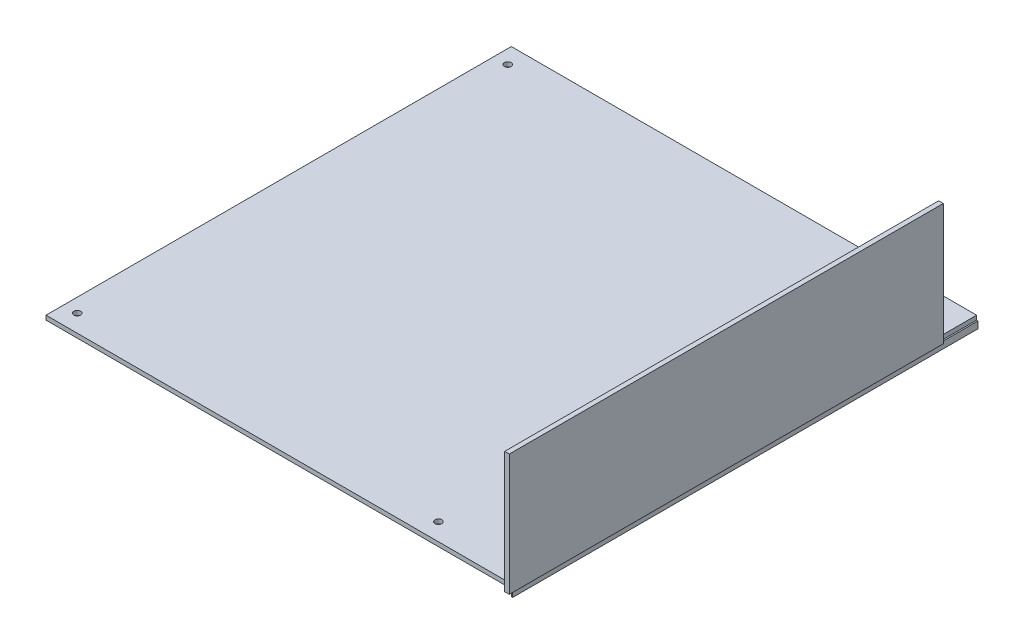
ISO-10303-21;
HEADER;
FILE_DESCRIPTION(('STEP AP214'),'2;1');
FILE_NAME('part.step','',(''),(''),'','','');
FILE_SCHEMA(('AUTOMOTIVE_DESIGN { 1 0 10303 214 1 1 1 1 }'));
ENDSEC;
DATA;
#1=APPLICATION_CONTEXT('core data for automotive mechanical design processes');
#2=APPLICATION_PROTOCOL_DEFINITION('international standard','automotive_design',2000,#1);
#3=PRODUCT_CONTEXT('',#1,'mechanical');
#4=PRODUCT('Part','Part','',(#3));
#5=PRODUCT_RELATED_PRODUCT_CATEGORY('part','',(#4));
#6=PRODUCT_DEFINITION_FORMATION('','',#4);
#7=PRODUCT_DEFINITION_CONTEXT('part definition',#1,'design');
#8=PRODUCT_DEFINITION('design','',#6,#7);
#9=PRODUCT_DEFINITION_SHAPE('','',#8);
#10=(LENGTH_UNIT() NAMED_UNIT(*) SI_UNIT(.MILLI.,.METRE.));
#11=(NAMED_UNIT(*) PLANE_ANGLE_UNIT() SI_UNIT($,.RADIAN.));
#12=(NAMED_UNIT(*) SI_UNIT($,.STERADIAN.) SOLID_ANGLE_UNIT());
#13=UNCERTAINTY_MEASURE_WITH_UNIT(LENGTH_MEASURE(1.E-05),#10,'distance_accuracy_value','');
#14=(GEOMETRIC_REPRESENTATION_CONTEXT(3) GLOBAL_UNCERTAINTY_ASSIGNED_CONTEXT((#13)) GLOBAL_UNIT_ASSIGNED_CONTEXT((#10,
#11,#12)) REPRESENTATION_CONTEXT('',''));
#15=CARTESIAN_POINT('',(0.,0.,0.));
#16=DIRECTION('',(0.,0.,1.));
#17=DIRECTION('',(1.,0.,0.));
#18=AXIS2_PLACEMENT_3D('',#15,#16,#17);
#19=CARTESIAN_POINT('',(0.5,0.,0.));
#20=DIRECTION('',(0.,0.,-1.));
#21=DIRECTION('',(0.,1.,0.));
#22=AXIS2_PLACEMENT_3D('',#19,#20,#21);
#23=PLANE('',#22);
#24=DIRECTION('',(0.,-1.,0.));
#25=VECTOR('',#24,1.);
#26=CARTESIAN_POINT('',(0.,0.,0.));
#27=LINE('',#26,#25);
#28=CARTESIAN_POINT('',(0.,0.,0.));
#29=VERTEX_POINT('',#28);
#30=CARTESIAN_POINT('',(0.,-2.5,0.));
#31=VERTEX_POINT('',#30);
#32=EDGE_CURVE('E110',#29,#31,#27,.T.);
#33=ORIENTED_EDGE('',*,*,#32,.T.);
#34=DIRECTION('',(-1.,0.,0.));
#35=VECTOR('',#34,1.);
#36=CARTESIAN_POINT('',(0.5,-2.5,0.));
#37=LINE('',#36,#35);
#38=CARTESIAN_POINT('',(0.5,-2.5,0.));
#39=VERTEX_POINT('',#38);
#40=EDGE_CURVE('E12',#39,#31,#37,.T.);
#41=ORIENTED_EDGE('',*,*,#40,.F.);
#42=DIRECTION('',(0.,-1.,0.));
#43=VECTOR('',#42,1.);
#44=CARTESIAN_POINT('',(0.5,0.,0.));
#45=LINE('',#44,#43);
#46=CARTESIAN_POINT('',(0.5,0.,0.));
#47=VERTEX_POINT('',#46);
#48=EDGE_CURVE('E98',#47,#39,#45,.T.);
#49=ORIENTED_EDGE('',*,*,#48,.F.);
#50=DIRECTION('',(-1.,0.,0.));
#51=VECTOR('',#50,1.);
#52=CARTESIAN_POINT('',(0.5,0.,0.));
#53=LINE('',#52,#51);
#54=EDGE_CURVE('E106',#47,#29,#53,.T.);
#55=ORIENTED_EDGE('',*,*,#54,.T.);
#56=EDGE_LOOP('',(#33,#41,#49,#55));
#57=FACE_BOUND('',#56,.T.);
#58=ADVANCED_FACE('F47',(#57),#23,.F.);
#59=CARTESIAN_POINT('',(0.5,-2.5,0.));
#60=DIRECTION('',(0.,1.,0.));
#61=DIRECTION('',(0.,0.,1.));
#62=AXIS2_PLACEMENT_3D('',#59,#60,#61);
#63=PLANE('',#62);
#64=DIRECTION('',(0.,0.,-1.));
#65=VECTOR('',#64,1.);
#66=CARTESIAN_POINT('',(0.,-2.5,0.));
#67=LINE('',#66,#65);
#68=CARTESIAN_POINT('',(0.,-2.5,-170.18));
#69=VERTEX_POINT('',#68);
#70=EDGE_CURVE('E102',#31,#69,#67,.T.);
#71=ORIENTED_EDGE('',*,*,#70,.T.);
#72=DIRECTION('',(-1.,0.,0.));
#73=VECTOR('',#72,1.);
#74=CARTESIAN_POINT('',(0.5,-2.5,-170.18));
#75=LINE('',#74,#73);
#76=CARTESIAN_POINT('',(0.5,-2.5,-170.18));
#77=VERTEX_POINT('',#76);
#78=EDGE_CURVE('E55',#77,#69,#75,.T.);
#79=ORIENTED_EDGE('',*,*,#78,.F.);
#80=DIRECTION('',(0.,0.,-1.));
#81=VECTOR('',#80,1.);
#82=CARTESIAN_POINT('',(0.5,-2.5,0.));
#83=LINE('',#82,#81);
#84=EDGE_CURVE('E93',#39,#77,#83,.T.);
#85=ORIENTED_EDGE('',*,*,#84,.F.);
#86=ORIENTED_EDGE('',*,*,#40,.T.);
#87=EDGE_LOOP('',(#71,#79,#85,#86));
#88=FACE_BOUND('',#87,.T.);
#89=ADVANCED_FACE('F101',(#88),#63,.F.);
#90=CARTESIAN_POINT('',(0.5,0.,-170.18));
#91=DIRECTION('',(0.,0.,1.));
#92=DIRECTION('',(1.,0.,0.));
#93=AXIS2_PLACEMENT_3D('',#90,#91,#92);
#94=PLANE('',#93);
#95=DIRECTION('',(0.,1.,0.));
#96=VECTOR('',#95,1.);
#97=CARTESIAN_POINT('',(0.,0.,-170.18));
#98=LINE('',#97,#96);
#99=CARTESIAN_POINT('',(0.,0.,-170.18));
#100=VERTEX_POINT('',#99);
#101=EDGE_CURVE('E80',#69,#100,#98,.T.);
#102=ORIENTED_EDGE('',*,*,#101,.T.);
#103=DIRECTION('',(-1.,0.,0.));
#104=VECTOR('',#103,1.);
#105=CARTESIAN_POINT('',(0.5,0.,-170.18));
#106=LINE('',#105,#104);
#107=CARTESIAN_POINT('',(0.5,0.,-170.18));
#108=VERTEX_POINT('',#107);
#109=EDGE_CURVE('E103',#108,#100,#106,.T.);
#110=ORIENTED_EDGE('',*,*,#109,.F.);
#111=DIRECTION('',(0.,1.,0.));
#112=VECTOR('',#111,1.);
#113=CARTESIAN_POINT('',(0.5,0.,-170.18));
#114=LINE('',#113,#112);
#115=EDGE_CURVE('E96',#77,#108,#114,.T.);
#116=ORIENTED_EDGE('',*,*,#115,.F.);
#117=ORIENTED_EDGE('',*,*,#78,.T.);
#118=EDGE_LOOP('',(#102,#110,#116,#117));
#119=FACE_BOUND('',#118,.T.);
#120=ADVANCED_FACE('F104',(#119),#94,.F.);
#121=CARTESIAN_POINT('',(0.5,0.,0.));
#122=DIRECTION('',(0.,-1.,0.));
#123=DIRECTION('',(0.,0.,-1.));
#124=AXIS2_PLACEMENT_3D('',#121,#122,#123);
#125=PLANE('',#124);
#126=DIRECTION('',(0.,0.,1.));
#127=VECTOR('',#126,1.);
#128=CARTESIAN_POINT('',(0.,0.,0.));
#129=LINE('',#128,#127);
#130=EDGE_CURVE('E86',#100,#29,#129,.T.);
#131=ORIENTED_EDGE('',*,*,#130,.T.);
#132=ORIENTED_EDGE('',*,*,#54,.F.);
#133=DIRECTION('',(0.,0.,1.));
#134=VECTOR('',#133,1.);
#135=CARTESIAN_POINT('',(0.5,0.,0.));
#136=LINE('',#135,#134);
#137=EDGE_CURVE('E63',#108,#47,#136,.T.);
#138=ORIENTED_EDGE('',*,*,#137,.F.);
#139=ORIENTED_EDGE('',*,*,#109,.T.);
#140=EDGE_LOOP('',(#131,#132,#138,#139));
#141=FACE_BOUND('',#140,.T.);
#142=ADVANCED_FACE('F117',(#141),#125,.F.);
#143=CARTESIAN_POINT('',(0.5,0.,0.));
#144=DIRECTION('',(1.,0.,0.));
#145=DIRECTION('',(0.,0.,-1.));
#146=AXIS2_PLACEMENT_3D('',#143,#144,#145);
#147=PLANE('',#146);
#148=ORIENTED_EDGE('',*,*,#48,.T.);
#149=ORIENTED_EDGE('',*,*,#84,.T.);
#150=ORIENTED_EDGE('',*,*,#115,.T.);
#151=ORIENTED_EDGE('',*,*,#137,.T.);
#152=EDGE_LOOP('',(#148,#149,#150,#151));
#153=FACE_BOUND('',#152,.T.);
#154=ADVANCED_FACE('F94',(#153),#147,.T.);
#155=CARTESIAN_POINT('',(0.,0.,0.));
#156=DIRECTION('',(1.,0.,0.));
#157=DIRECTION('',(0.,0.,-1.));
#158=AXIS2_PLACEMENT_3D('',#155,#156,#157);
#159=PLANE('',#158);
#160=ORIENTED_EDGE('',*,*,#32,.F.);
#161=ORIENTED_EDGE('',*,*,#130,.F.);
#162=ORIENTED_EDGE('',*,*,#101,.F.);
#163=ORIENTED_EDGE('',*,*,#70,.F.);
#164=EDGE_LOOP('',(#160,#161,#162,#163));
#165=FACE_BOUND('',#164,.T.);
#166=ADVANCED_FACE('F120',(#165),#159,.F.);
#167=CLOSED_SHELL('',(#58,#89,#120,#142,#154,#166));
#168=MANIFOLD_SOLID_BREP('B2',#167);
#169=CARTESIAN_POINT('',(0.,1.57,0.));
#170=DIRECTION('',(-1.,0.,0.));
#171=DIRECTION('',(0.,0.,1.));
#172=AXIS2_PLACEMENT_3D('',#169,#170,#171);
#173=PLANE('',#172);
#174=DIRECTION('',(0.,1.,0.));
#175=VECTOR('',#174,1.);
#176=CARTESIAN_POINT('',(0.,44.75,-156.31));
#177=LINE('',#176,#175);
#178=CARTESIAN_POINT('',(0.,0.300000000000002,-156.31));
#179=VERTEX_POINT('',#178);
#180=CARTESIAN_POINT('',(0.,1.57,-156.31));
#181=VERTEX_POINT('',#180);
#182=EDGE_CURVE('E345',#179,#181,#177,.T.);
#183=ORIENTED_EDGE('',*,*,#182,.F.);
#184=DIRECTION('',(0.,0.,-1.));
#185=VECTOR('',#184,1.);
#186=CARTESIAN_POINT('',(0.,0.300000000000002,-156.31));
#187=LINE('',#186,#185);
#188=CARTESIAN_POINT('',(0.,0.299999999999991,0.));
#189=VERTEX_POINT('',#188);
#190=EDGE_CURVE('E45',#189,#179,#187,.T.);
#191=ORIENTED_EDGE('',*,*,#190,.F.);
#192=DIRECTION('',(0.,-1.,0.));
#193=VECTOR('',#192,1.);
#194=CARTESIAN_POINT('',(0.,1.57,0.));
#195=LINE('',#194,#193);
#196=CARTESIAN_POINT('',(0.,0.,0.));
#197=VERTEX_POINT('',#196);
#198=EDGE_CURVE('E303',#189,#197,#195,.T.);
#199=ORIENTED_EDGE('',*,*,#198,.T.);
#200=DIRECTION('',(0.,0.,-1.));
#201=VECTOR('',#200,1.);
#202=CARTESIAN_POINT('',(0.,0.,0.));
#203=LINE('',#202,#201);
#204=CARTESIAN_POINT('',(0.,0.,-170.18));
#205=VERTEX_POINT('',#204);
#206=EDGE_CURVE('E294',#197,#205,#203,.T.);
#207=ORIENTED_EDGE('',*,*,#206,.T.);
#208=DIRECTION('',(0.,-1.,0.));
#209=VECTOR('',#208,1.);
#210=CARTESIAN_POINT('',(0.,1.57,-170.18));
#211=LINE('',#210,#209);
#212=CARTESIAN_POINT('',(0.,1.57,-170.18));
#213=VERTEX_POINT('',#212);
#214=EDGE_CURVE('E174',#213,#205,#211,.T.);
#215=ORIENTED_EDGE('',*,*,#214,.F.);
#216=DIRECTION('',(0.,0.,-1.));
#217=VECTOR('',#216,1.);
#218=CARTESIAN_POINT('',(0.,1.57,0.));
#219=LINE('',#218,#217);
#220=EDGE_CURVE('E191',#181,#213,#219,.T.);
#221=ORIENTED_EDGE('',*,*,#220,.F.);
#222=EDGE_LOOP('',(#183,#191,#199,#207,#215,#221));
#223=FACE_BOUND('',#222,.T.);
#224=ADVANCED_FACE('F171',(#223),#173,.F.);
#225=CARTESIAN_POINT('',(0.,1.57,-170.18));
#226=DIRECTION('',(0.,0.,1.));
#227=DIRECTION('',(1.,0.,0.));
#228=AXIS2_PLACEMENT_3D('',#225,#226,#227);
#229=PLANE('',#228);
#230=DIRECTION('',(-1.,0.,0.));
#231=VECTOR('',#230,1.);
#232=CARTESIAN_POINT('',(0.,0.,-170.18));
#233=LINE('',#232,#231);
#234=CARTESIAN_POINT('',(-170.18,0.,-170.18));
#235=VERTEX_POINT('',#234);
#236=EDGE_CURVE('E306',#205,#235,#233,.T.);
#237=ORIENTED_EDGE('',*,*,#236,.T.);
#238=DIRECTION('',(0.,-1.,0.));
#239=VECTOR('',#238,1.);
#240=CARTESIAN_POINT('',(-170.18,1.57,-170.18));
#241=LINE('',#240,#239);
#242=CARTESIAN_POINT('',(-170.18,1.57,-170.18));
#243=VERTEX_POINT('',#242);
#244=EDGE_CURVE('E318',#243,#235,#241,.T.);
#245=ORIENTED_EDGE('',*,*,#244,.F.);
#246=DIRECTION('',(-1.,0.,0.));
#247=VECTOR('',#246,1.);
#248=CARTESIAN_POINT('',(0.,1.57,-170.18));
#249=LINE('',#248,#247);
#250=EDGE_CURVE('E297',#213,#243,#249,.T.);
#251=ORIENTED_EDGE('',*,*,#250,.F.);
#252=ORIENTED_EDGE('',*,*,#214,.T.);
#253=EDGE_LOOP('',(#237,#245,#251,#252));
#254=FACE_BOUND('',#253,.T.);
#255=ADVANCED_FACE('F327',(#254),#229,.F.);
#256=CARTESIAN_POINT('',(-170.18,1.57,0.));
#257=DIRECTION('',(1.,0.,0.));
#258=DIRECTION('',(0.,0.,-1.));
#259=AXIS2_PLACEMENT_3D('',#256,#257,#258);
#260=PLANE('',#259);
#261=DIRECTION('',(0.,0.,1.));
#262=VECTOR('',#261,1.);
#263=CARTESIAN_POINT('',(-170.18,0.,0.));
#264=LINE('',#263,#262);
#265=CARTESIAN_POINT('',(-170.18,0.,0.));
#266=VERTEX_POINT('',#265);
#267=EDGE_CURVE('E308',#235,#266,#264,.T.);
#268=ORIENTED_EDGE('',*,*,#267,.T.);
#269=DIRECTION('',(0.,-1.,0.));
#270=VECTOR('',#269,1.);
#271=CARTESIAN_POINT('',(-170.18,1.57,0.));
#272=LINE('',#271,#270);
#273=CARTESIAN_POINT('',(-170.18,1.57,0.));
#274=VERTEX_POINT('',#273);
#275=EDGE_CURVE('E316',#274,#266,#272,.T.);
#276=ORIENTED_EDGE('',*,*,#275,.F.);
#277=DIRECTION('',(0.,0.,1.));
#278=VECTOR('',#277,1.);
#279=CARTESIAN_POINT('',(-170.18,1.57,0.));
#280=LINE('',#279,#278);
#281=EDGE_CURVE('E299',#243,#274,#280,.T.);
#282=ORIENTED_EDGE('',*,*,#281,.F.);
#283=ORIENTED_EDGE('',*,*,#244,.T.);
#284=EDGE_LOOP('',(#268,#276,#282,#283));
#285=FACE_BOUND('',#284,.T.);
#286=ADVANCED_FACE('F333',(#285),#260,.F.);
#287=CARTESIAN_POINT('',(0.,1.57,0.));
#288=DIRECTION('',(0.,0.,-1.));
#289=DIRECTION('',(-1.,0.,0.));
#290=AXIS2_PLACEMENT_3D('',#287,#288,#289);
#291=PLANE('',#290);
#292=DIRECTION('',(1.,0.,0.));
#293=VECTOR('',#292,1.);
#294=CARTESIAN_POINT('',(0.,0.,0.));
#295=LINE('',#294,#293);
#296=EDGE_CURVE('E310',#266,#197,#295,.T.);
#297=ORIENTED_EDGE('',*,*,#296,.T.);
#298=ORIENTED_EDGE('',*,*,#198,.F.);
#299=CARTESIAN_POINT('',(0.,1.57,0.));
#300=VERTEX_POINT('',#299);
#301=EDGE_CURVE('E313',#300,#189,#195,.T.);
#302=ORIENTED_EDGE('',*,*,#301,.F.);
#303=DIRECTION('',(1.,0.,0.));
#304=VECTOR('',#303,1.);
#305=CARTESIAN_POINT('',(0.,1.57,0.));
#306=LINE('',#305,#304);
#307=EDGE_CURVE('E301',#274,#300,#306,.T.);
#308=ORIENTED_EDGE('',*,*,#307,.F.);
#309=ORIENTED_EDGE('',*,*,#275,.T.);
#310=EDGE_LOOP('',(#297,#298,#302,#308,#309));
#311=FACE_BOUND('',#310,.T.);
#312=ADVANCED_FACE('F336',(#311),#291,.F.);
#313=CARTESIAN_POINT('',(0.,1.57,0.));
#314=DIRECTION('',(0.,1.,0.));
#315=DIRECTION('',(0.,0.,1.));
#316=AXIS2_PLACEMENT_3D('',#313,#314,#315);
#317=PLANE('',#316);
#318=CARTESIAN_POINT('',(-165.1,1.57,-163.83));
#319=DIRECTION('',(0.,1.,0.));
#320=DIRECTION('',(0.,0.,1.));
#321=AXIS2_PLACEMENT_3D('',#318,#319,#320);
#322=CIRCLE('',#321,1.25);
#323=CARTESIAN_POINT('',(-165.1,1.57,-162.58));
#324=VERTEX_POINT('',#323);
#325=EDGE_CURVE('E265',#324,#324,#322,.T.);
#326=ORIENTED_EDGE('',*,*,#325,.F.);
#327=EDGE_LOOP('',(#326));
#328=FACE_BOUND('',#327,.T.);
#329=CARTESIAN_POINT('',(-10.16,1.57,-163.83));
#330=DIRECTION('',(0.,1.,0.));
#331=DIRECTION('',(0.,0.,1.));
#332=AXIS2_PLACEMENT_3D('',#329,#330,#331);
#333=CIRCLE('',#332,1.24999999999999);
#334=CARTESIAN_POINT('',(-10.16,1.57,-162.58));
#335=VERTEX_POINT('',#334);
#336=EDGE_CURVE('E276',#335,#335,#333,.T.);
#337=ORIENTED_EDGE('',*,*,#336,.F.);
#338=EDGE_LOOP('',(#337));
#339=FACE_BOUND('',#338,.T.);
#340=CARTESIAN_POINT('',(-33.02,1.57,-6.34999999999998));
#341=DIRECTION('',(0.,1.,0.));
#342=DIRECTION('',(0.,0.,1.));
#343=AXIS2_PLACEMENT_3D('',#340,#341,#342);
#344=CIRCLE('',#343,1.24999999999999);
#345=CARTESIAN_POINT('',(-33.02,1.57,-5.09999999999999));
#346=VERTEX_POINT('',#345);
#347=EDGE_CURVE('E282',#346,#346,#344,.T.);
#348=ORIENTED_EDGE('',*,*,#347,.F.);
#349=EDGE_LOOP('',(#348));
#350=FACE_BOUND('',#349,.T.);
#351=CARTESIAN_POINT('',(-165.1,1.57,-6.34999999999996));
#352=DIRECTION('',(0.,1.,0.));
#353=DIRECTION('',(0.,0.,1.));
#354=AXIS2_PLACEMENT_3D('',#351,#352,#353);
#355=CIRCLE('',#354,1.24999999999997);
#356=CARTESIAN_POINT('',(-165.1,1.57,-5.09999999999999));
#357=VERTEX_POINT('',#356);
#358=EDGE_CURVE('E288',#357,#357,#355,.T.);
#359=ORIENTED_EDGE('',*,*,#358,.F.);
#360=EDGE_LOOP('',(#359));
#361=FACE_BOUND('',#360,.T.);
#362=EDGE_CURVE('E295',#300,#181,#219,.T.);
#363=ORIENTED_EDGE('',*,*,#362,.T.);
#364=ORIENTED_EDGE('',*,*,#220,.T.);
#365=ORIENTED_EDGE('',*,*,#250,.T.);
#366=ORIENTED_EDGE('',*,*,#281,.T.);
#367=ORIENTED_EDGE('',*,*,#307,.T.);
#368=EDGE_LOOP('',(#363,#364,#365,#366,#367));
#369=FACE_BOUND('',#368,.T.);
#370=ADVANCED_FACE('F340',(#328,#339,#350,#361,#369),#317,.T.);
#371=CARTESIAN_POINT('',(0.,0.,0.));
#372=DIRECTION('',(0.,1.,0.));
#373=DIRECTION('',(0.,0.,1.));
#374=AXIS2_PLACEMENT_3D('',#371,#372,#373);
#375=PLANE('',#374);
#376=CARTESIAN_POINT('',(-165.1,0.,-163.83));
#377=DIRECTION('',(0.,1.,0.));
#378=DIRECTION('',(0.,0.,1.));
#379=AXIS2_PLACEMENT_3D('',#376,#377,#378);
#380=CIRCLE('',#379,1.25);
#381=CARTESIAN_POINT('',(-165.1,0.,-162.58));
#382=VERTEX_POINT('',#381);
#383=EDGE_CURVE('E268',#382,#382,#380,.T.);
#384=ORIENTED_EDGE('',*,*,#383,.T.);
#385=EDGE_LOOP('',(#384));
#386=FACE_BOUND('',#385,.T.);
#387=CARTESIAN_POINT('',(-10.16,0.,-163.83));
#388=DIRECTION('',(0.,1.,0.));
#389=DIRECTION('',(0.,0.,1.));
#390=AXIS2_PLACEMENT_3D('',#387,#388,#389);
#391=CIRCLE('',#390,1.24999999999999);
#392=CARTESIAN_POINT('',(-10.16,0.,-162.58));
#393=VERTEX_POINT('',#392);
#394=EDGE_CURVE('E279',#393,#393,#391,.T.);
#395=ORIENTED_EDGE('',*,*,#394,.T.);
#396=EDGE_LOOP('',(#395));
#397=FACE_BOUND('',#396,.T.);
#398=CARTESIAN_POINT('',(-33.02,0.,-6.34999999999998));
#399=DIRECTION('',(0.,1.,0.));
#400=DIRECTION('',(0.,0.,1.));
#401=AXIS2_PLACEMENT_3D('',#398,#399,#400);
#402=CIRCLE('',#401,1.24999999999999);
#403=CARTESIAN_POINT('',(-33.02,0.,-5.09999999999998));
#404=VERTEX_POINT('',#403);
#405=EDGE_CURVE('E285',#404,#404,#402,.T.);
#406=ORIENTED_EDGE('',*,*,#405,.T.);
#407=EDGE_LOOP('',(#406));
#408=FACE_BOUND('',#407,.T.);
#409=CARTESIAN_POINT('',(-165.1,0.,-6.34999999999996));
#410=DIRECTION('',(0.,1.,0.));
#411=DIRECTION('',(0.,0.,1.));
#412=AXIS2_PLACEMENT_3D('',#409,#410,#411);
#413=CIRCLE('',#412,1.24999999999999);
#414=CARTESIAN_POINT('',(-165.1,0.,-5.09999999999997));
#415=VERTEX_POINT('',#414);
#416=EDGE_CURVE('E291',#415,#415,#413,.T.);
#417=ORIENTED_EDGE('',*,*,#416,.T.);
#418=EDGE_LOOP('',(#417));
#419=FACE_BOUND('',#418,.T.);
#420=ORIENTED_EDGE('',*,*,#206,.F.);
#421=ORIENTED_EDGE('',*,*,#296,.F.);
#422=ORIENTED_EDGE('',*,*,#267,.F.);
#423=ORIENTED_EDGE('',*,*,#236,.F.);
#424=EDGE_LOOP('',(#420,#421,#422,#423));
#425=FACE_BOUND('',#424,.T.);
#426=ADVANCED_FACE('F331',(#386,#397,#408,#419,#425),#375,.F.);
#427=CARTESIAN_POINT('',(-165.1,1.57,-6.34999999999996));
#428=DIRECTION('',(0.,1.,0.));
#429=DIRECTION('',(0.,0.,1.));
#430=AXIS2_PLACEMENT_3D('',#427,#428,#429);
#431=CYLINDRICAL_SURFACE('',#430,1.24999999999999);
#432=ORIENTED_EDGE('',*,*,#416,.F.);
#433=EDGE_LOOP('',(#432));
#434=FACE_BOUND('',#433,.T.);
#435=ORIENTED_EDGE('',*,*,#358,.T.);
#436=EDGE_LOOP('',(#435));
#437=FACE_BOUND('',#436,.T.);
#438=ADVANCED_FACE('F384',(#434,#437),#431,.F.);
#439=CARTESIAN_POINT('',(-33.02,1.57,-6.34999999999998));
#440=DIRECTION('',(0.,1.,0.));
#441=DIRECTION('',(0.,0.,1.));
#442=AXIS2_PLACEMENT_3D('',#439,#440,#441);
#443=CYLINDRICAL_SURFACE('',#442,1.24999999999999);
#444=ORIENTED_EDGE('',*,*,#405,.F.);
#445=EDGE_LOOP('',(#444));
#446=FACE_BOUND('',#445,.T.);
#447=ORIENTED_EDGE('',*,*,#347,.T.);
#448=EDGE_LOOP('',(#447));
#449=FACE_BOUND('',#448,.T.);
#450=ADVANCED_FACE('F391',(#446,#449),#443,.F.);
#451=CARTESIAN_POINT('',(-10.16,1.57,-163.83));
#452=DIRECTION('',(0.,1.,0.));
#453=DIRECTION('',(0.,0.,1.));
#454=AXIS2_PLACEMENT_3D('',#451,#452,#453);
#455=CYLINDRICAL_SURFACE('',#454,1.24999999999999);
#456=ORIENTED_EDGE('',*,*,#394,.F.);
#457=EDGE_LOOP('',(#456));
#458=FACE_BOUND('',#457,.T.);
#459=ORIENTED_EDGE('',*,*,#336,.T.);
#460=EDGE_LOOP('',(#459));
#461=FACE_BOUND('',#460,.T.);
#462=ADVANCED_FACE('F395',(#458,#461),#455,.F.);
#463=CARTESIAN_POINT('',(-165.1,1.57,-163.83));
#464=DIRECTION('',(0.,1.,0.));
#465=DIRECTION('',(0.,0.,1.));
#466=AXIS2_PLACEMENT_3D('',#463,#464,#465);
#467=CYLINDRICAL_SURFACE('',#466,1.25);
#468=ORIENTED_EDGE('',*,*,#383,.F.);
#469=EDGE_LOOP('',(#468));
#470=FACE_BOUND('',#469,.T.);
#471=ORIENTED_EDGE('',*,*,#325,.T.);
#472=EDGE_LOOP('',(#471));
#473=FACE_BOUND('',#472,.T.);
#474=ADVANCED_FACE('F399',(#470,#473),#467,.F.);
#475=CARTESIAN_POINT('',(0.,0.,0.));
#476=DIRECTION('',(-1.,0.,0.));
#477=DIRECTION('',(0.,0.,1.));
#478=AXIS2_PLACEMENT_3D('',#475,#476,#477);
#479=PLANE('',#478);
#480=ORIENTED_EDGE('',*,*,#362,.F.);
#481=ORIENTED_EDGE('',*,*,#301,.T.);
#482=CARTESIAN_POINT('',(0.,0.299999999999981,2.44000000000005));
#483=VERTEX_POINT('',#482);
#484=EDGE_CURVE('E180',#483,#189,#187,.T.);
#485=ORIENTED_EDGE('',*,*,#484,.F.);
#486=DIRECTION('',(0.,-1.,0.));
#487=VECTOR('',#486,1.);
#488=CARTESIAN_POINT('',(0.,44.75,2.44000000000005));
#489=LINE('',#488,#487);
#490=CARTESIAN_POINT('',(0.,44.75,2.44000000000005));
#491=VERTEX_POINT('',#490);
#492=EDGE_CURVE('E348',#491,#483,#489,.T.);
#493=ORIENTED_EDGE('',*,*,#492,.F.);
#494=DIRECTION('',(0.,0.,1.));
#495=VECTOR('',#494,1.);
#496=CARTESIAN_POINT('',(0.,44.75,-156.31));
#497=LINE('',#496,#495);
#498=CARTESIAN_POINT('',(0.,44.75,-156.31));
#499=VERTEX_POINT('',#498);
#500=EDGE_CURVE('E344',#499,#491,#497,.T.);
#501=ORIENTED_EDGE('',*,*,#500,.F.);
#502=EDGE_CURVE('E263',#181,#499,#177,.T.);
#503=ORIENTED_EDGE('',*,*,#502,.F.);
#504=EDGE_LOOP('',(#480,#481,#485,#493,#501,#503));
#505=FACE_BOUND('',#504,.T.);
#506=ADVANCED_FACE('F342',(#505),#479,.T.);
#507=CARTESIAN_POINT('',(1.7,44.75,-156.31));
#508=DIRECTION('',(0.,0.,1.));
#509=DIRECTION('',(1.,0.,0.));
#510=AXIS2_PLACEMENT_3D('',#507,#508,#509);
#511=PLANE('',#510);
#512=ORIENTED_EDGE('',*,*,#182,.T.);
#513=ORIENTED_EDGE('',*,*,#502,.T.);
#514=DIRECTION('',(-1.,0.,0.));
#515=VECTOR('',#514,1.);
#516=CARTESIAN_POINT('',(1.7,44.75,-156.31));
#517=LINE('',#516,#515);
#518=CARTESIAN_POINT('',(1.7,44.75,-156.31));
#519=VERTEX_POINT('',#518);
#520=EDGE_CURVE('E244',#519,#499,#517,.T.);
#521=ORIENTED_EDGE('',*,*,#520,.F.);
#522=DIRECTION('',(0.,1.,0.));
#523=VECTOR('',#522,1.);
#524=CARTESIAN_POINT('',(1.7,44.75,-156.31));
#525=LINE('',#524,#523);
#526=CARTESIAN_POINT('',(1.7,0.300000000000002,-156.31));
#527=VERTEX_POINT('',#526);
#528=EDGE_CURVE('E250',#527,#519,#525,.T.);
#529=ORIENTED_EDGE('',*,*,#528,.F.);
#530=DIRECTION('',(-1.,0.,0.));
#531=VECTOR('',#530,1.);
#532=CARTESIAN_POINT('',(1.7,0.300000000000002,-156.31));
#533=LINE('',#532,#531);
#534=EDGE_CURVE('E347',#527,#179,#533,.T.);
#535=ORIENTED_EDGE('',*,*,#534,.T.);
#536=EDGE_LOOP('',(#512,#513,#521,#529,#535));
#537=FACE_BOUND('',#536,.T.);
#538=ADVANCED_FACE('F261',(#537),#511,.F.);
#539=CARTESIAN_POINT('',(1.7,44.75,-156.31));
#540=DIRECTION('',(0.,-1.,0.));
#541=DIRECTION('',(0.,0.,-1.));
#542=AXIS2_PLACEMENT_3D('',#539,#540,#541);
#543=PLANE('',#542);
#544=ORIENTED_EDGE('',*,*,#500,.T.);
#545=DIRECTION('',(-1.,0.,0.));
#546=VECTOR('',#545,1.);
#547=CARTESIAN_POINT('',(1.7,44.75,2.44000000000005));
#548=LINE('',#547,#546);
#549=CARTESIAN_POINT('',(1.7,44.75,2.44000000000005));
#550=VERTEX_POINT('',#549);
#551=EDGE_CURVE('E246',#550,#491,#548,.T.);
#552=ORIENTED_EDGE('',*,*,#551,.F.);
#553=DIRECTION('',(0.,0.,1.));
#554=VECTOR('',#553,1.);
#555=CARTESIAN_POINT('',(1.7,44.75,-156.31));
#556=LINE('',#555,#554);
#557=EDGE_CURVE('E240',#519,#550,#556,.T.);
#558=ORIENTED_EDGE('',*,*,#557,.F.);
#559=ORIENTED_EDGE('',*,*,#520,.T.);
#560=EDGE_LOOP('',(#544,#552,#558,#559));
#561=FACE_BOUND('',#560,.T.);
#562=ADVANCED_FACE('F242',(#561),#543,.F.);
#563=CARTESIAN_POINT('',(1.7,44.75,2.44000000000005));
#564=DIRECTION('',(0.,0.,-1.));
#565=DIRECTION('',(0.,1.,0.));
#566=AXIS2_PLACEMENT_3D('',#563,#564,#565);
#567=PLANE('',#566);
#568=ORIENTED_EDGE('',*,*,#492,.T.);
#569=DIRECTION('',(-1.,0.,0.));
#570=VECTOR('',#569,1.);
#571=CARTESIAN_POINT('',(1.7,0.299999999999981,2.44000000000005));
#572=LINE('',#571,#570);
#573=CARTESIAN_POINT('',(1.7,0.299999999999981,2.44000000000005));
#574=VERTEX_POINT('',#573);
#575=EDGE_CURVE('E270',#574,#483,#572,.T.);
#576=ORIENTED_EDGE('',*,*,#575,.F.);
#577=DIRECTION('',(0.,-1.,0.));
#578=VECTOR('',#577,1.);
#579=CARTESIAN_POINT('',(1.7,44.75,2.44000000000005));
#580=LINE('',#579,#578);
#581=EDGE_CURVE('E249',#550,#574,#580,.T.);
#582=ORIENTED_EDGE('',*,*,#581,.F.);
#583=ORIENTED_EDGE('',*,*,#551,.T.);
#584=EDGE_LOOP('',(#568,#576,#582,#583));
#585=FACE_BOUND('',#584,.T.);
#586=ADVANCED_FACE('F361',(#585),#567,.F.);
#587=CARTESIAN_POINT('',(1.7,0.300000000000002,-156.31));
#588=DIRECTION('',(0.,1.,0.));
#589=DIRECTION('',(0.,0.,1.));
#590=AXIS2_PLACEMENT_3D('',#587,#588,#589);
#591=PLANE('',#590);
#592=ORIENTED_EDGE('',*,*,#484,.T.);
#593=ORIENTED_EDGE('',*,*,#190,.T.);
#594=ORIENTED_EDGE('',*,*,#534,.F.);
#595=DIRECTION('',(0.,0.,-1.));
#596=VECTOR('',#595,1.);
#597=CARTESIAN_POINT('',(1.7,0.300000000000002,-156.31));
#598=LINE('',#597,#596);
#599=EDGE_CURVE('E255',#574,#527,#598,.T.);
#600=ORIENTED_EDGE('',*,*,#599,.F.);
#601=ORIENTED_EDGE('',*,*,#575,.T.);
#602=EDGE_LOOP('',(#592,#593,#594,#600,#601));
#603=FACE_BOUND('',#602,.T.);
#604=ADVANCED_FACE('F359',(#603),#591,.F.);
#605=CARTESIAN_POINT('',(1.7,0.,0.));
#606=DIRECTION('',(-1.,0.,0.));
#607=DIRECTION('',(0.,0.,1.));
#608=AXIS2_PLACEMENT_3D('',#605,#606,#607);
#609=PLANE('',#608);
#610=ORIENTED_EDGE('',*,*,#528,.T.);
#611=ORIENTED_EDGE('',*,*,#557,.T.);
#612=ORIENTED_EDGE('',*,*,#581,.T.);
#613=ORIENTED_EDGE('',*,*,#599,.T.);
#614=EDGE_LOOP('',(#610,#611,#612,#613));
#615=FACE_BOUND('',#614,.T.);
#616=ADVANCED_FACE('F253',(#615),#609,.F.);
#617=CLOSED_SHELL('',(#224,#255,#286,#312,#370,#426,#438,#450,#462,#474,#506,#538,#562,#586,
#604,#616));
#618=MANIFOLD_SOLID_BREP('B6',#617);
#619=ADVANCED_BREP_SHAPE_REPRESENTATION('',(#18,#168,#618),#14);
#620=SHAPE_DEFINITION_REPRESENTATION(#9,#619);
ENDSEC;
END-ISO-10303-21;
